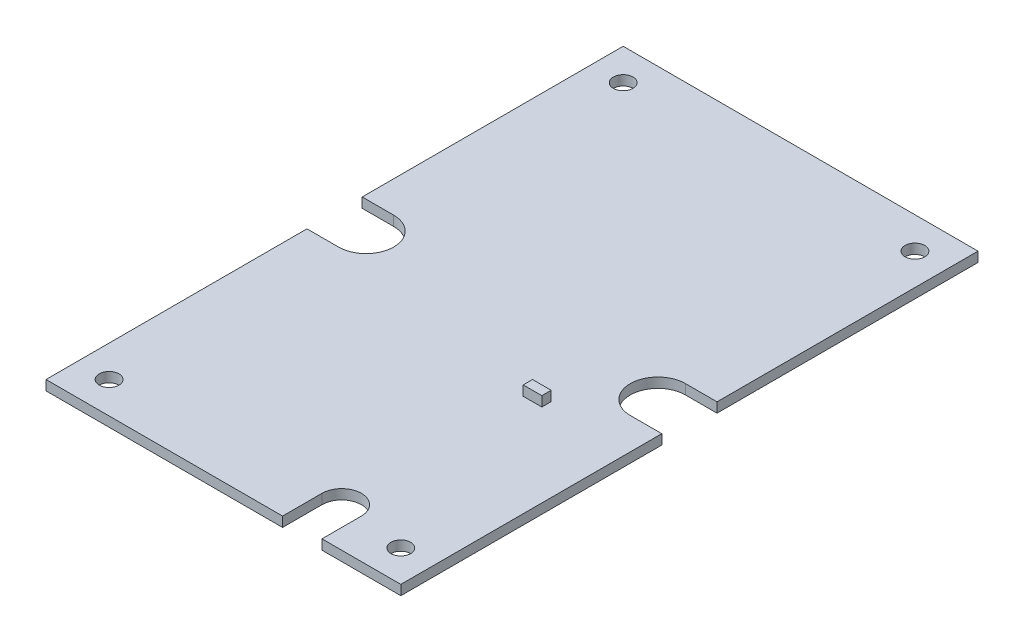
ISO-10303-21;
HEADER;
FILE_DESCRIPTION(('STEP AP214'),'2;1');
FILE_NAME('part.step','',(''),(''),'','','');
FILE_SCHEMA(('AUTOMOTIVE_DESIGN { 1 0 10303 214 1 1 1 1 }'));
ENDSEC;
DATA;
#1=APPLICATION_CONTEXT('core data for automotive mechanical design processes');
#2=APPLICATION_PROTOCOL_DEFINITION('international standard','automotive_design',2000,#1);
#3=PRODUCT_CONTEXT('',#1,'mechanical');
#4=PRODUCT('Part','Part','',(#3));
#5=PRODUCT_RELATED_PRODUCT_CATEGORY('part','',(#4));
#6=PRODUCT_DEFINITION_FORMATION('','',#4);
#7=PRODUCT_DEFINITION_CONTEXT('part definition',#1,'design');
#8=PRODUCT_DEFINITION('design','',#6,#7);
#9=PRODUCT_DEFINITION_SHAPE('','',#8);
#10=(LENGTH_UNIT() NAMED_UNIT(*) SI_UNIT(.MILLI.,.METRE.));
#11=(NAMED_UNIT(*) PLANE_ANGLE_UNIT() SI_UNIT($,.RADIAN.));
#12=(NAMED_UNIT(*) SI_UNIT($,.STERADIAN.) SOLID_ANGLE_UNIT());
#13=UNCERTAINTY_MEASURE_WITH_UNIT(LENGTH_MEASURE(1.E-05),#10,'distance_accuracy_value','');
#14=(GEOMETRIC_REPRESENTATION_CONTEXT(3) GLOBAL_UNCERTAINTY_ASSIGNED_CONTEXT((#13)) GLOBAL_UNIT_ASSIGNED_CONTEXT((#10,
#11,#12)) REPRESENTATION_CONTEXT('',''));
#15=CARTESIAN_POINT('',(0.,0.,0.));
#16=DIRECTION('',(0.,0.,1.));
#17=DIRECTION('',(1.,0.,0.));
#18=AXIS2_PLACEMENT_3D('',#15,#16,#17);
#19=CARTESIAN_POINT('',(0.,1.5875,0.));
#20=DIRECTION('',(0.,-1.,0.));
#21=DIRECTION('',(0.,0.,-1.));
#22=AXIS2_PLACEMENT_3D('',#19,#20,#21);
#23=PLANE('',#22);
#24=DIRECTION('',(0.,0.,-1.));
#25=VECTOR('',#24,1.);
#26=CARTESIAN_POINT('',(38.1,1.5875,0.));
#27=LINE('',#26,#25);
#28=CARTESIAN_POINT('',(38.1,1.5875,0.));
#29=VERTEX_POINT('',#28);
#30=CARTESIAN_POINT('',(38.1,1.5875,-6.35));
#31=VERTEX_POINT('',#30);
#32=EDGE_CURVE('E325',#29,#31,#27,.T.);
#33=ORIENTED_EDGE('',*,*,#32,.T.);
#34=CARTESIAN_POINT('',(41.275,1.5875,-6.35));
#35=DIRECTION('',(0.,1.,0.));
#36=DIRECTION('',(0.,0.,1.));
#37=AXIS2_PLACEMENT_3D('',#34,#35,#36);
#38=CIRCLE('',#37,3.17500000000001);
#39=CARTESIAN_POINT('',(44.45,1.5875,-6.35));
#40=VERTEX_POINT('',#39);
#41=EDGE_CURVE('E331',#40,#31,#38,.T.);
#42=ORIENTED_EDGE('',*,*,#41,.F.);
#43=DIRECTION('',(0.,0.,1.));
#44=VECTOR('',#43,1.);
#45=CARTESIAN_POINT('',(44.45,1.5875,0.));
#46=LINE('',#45,#44);
#47=CARTESIAN_POINT('',(44.45,1.5875,0.));
#48=VERTEX_POINT('',#47);
#49=EDGE_CURVE('E328',#40,#48,#46,.T.);
#50=ORIENTED_EDGE('',*,*,#49,.T.);
#51=DIRECTION('',(1.,0.,0.));
#52=VECTOR('',#51,1.);
#53=CARTESIAN_POINT('',(0.,1.5875,0.));
#54=LINE('',#53,#52);
#55=CARTESIAN_POINT('',(57.15,1.5875,0.));
#56=VERTEX_POINT('',#55);
#57=EDGE_CURVE('E422',#48,#56,#54,.T.);
#58=ORIENTED_EDGE('',*,*,#57,.T.);
#59=DIRECTION('',(0.,0.,-1.));
#60=VECTOR('',#59,1.);
#61=CARTESIAN_POINT('',(57.15,1.5875,0.));
#62=LINE('',#61,#60);
#63=CARTESIAN_POINT('',(57.15,1.5875,-42.037));
#64=VERTEX_POINT('',#63);
#65=EDGE_CURVE('E428',#56,#64,#62,.T.);
#66=ORIENTED_EDGE('',*,*,#65,.T.);
#67=DIRECTION('',(1.,0.,0.));
#68=VECTOR('',#67,1.);
#69=CARTESIAN_POINT('',(0.,1.5875,-42.037));
#70=LINE('',#69,#68);
#71=CARTESIAN_POINT('',(52.07,1.5875,-42.037));
#72=VERTEX_POINT('',#71);
#73=EDGE_CURVE('E348',#72,#64,#70,.T.);
#74=ORIENTED_EDGE('',*,*,#73,.F.);
#75=CARTESIAN_POINT('',(52.07,1.5875,-46.482));
#76=DIRECTION('',(0.,1.,0.));
#77=DIRECTION('',(0.,0.,1.));
#78=AXIS2_PLACEMENT_3D('',#75,#76,#77);
#79=CIRCLE('',#78,4.445);
#80=CARTESIAN_POINT('',(52.07,1.5875,-50.927));
#81=VERTEX_POINT('',#80);
#82=EDGE_CURVE('E358',#81,#72,#79,.T.);
#83=ORIENTED_EDGE('',*,*,#82,.F.);
#84=DIRECTION('',(-1.,0.,0.));
#85=VECTOR('',#84,1.);
#86=CARTESIAN_POINT('',(0.,1.5875,-50.927));
#87=LINE('',#86,#85);
#88=CARTESIAN_POINT('',(57.15,1.5875,-50.927));
#89=VERTEX_POINT('',#88);
#90=EDGE_CURVE('E355',#89,#81,#87,.T.);
#91=ORIENTED_EDGE('',*,*,#90,.F.);
#92=CARTESIAN_POINT('',(57.15,1.5875,-92.964));
#93=VERTEX_POINT('',#92);
#94=EDGE_CURVE('E427',#89,#93,#62,.T.);
#95=ORIENTED_EDGE('',*,*,#94,.T.);
#96=DIRECTION('',(-1.,0.,0.));
#97=VECTOR('',#96,1.);
#98=CARTESIAN_POINT('',(0.,1.5875,-92.964));
#99=LINE('',#98,#97);
#100=CARTESIAN_POINT('',(0.,1.5875,-92.964));
#101=VERTEX_POINT('',#100);
#102=EDGE_CURVE('E431',#93,#101,#99,.T.);
#103=ORIENTED_EDGE('',*,*,#102,.T.);
#104=DIRECTION('',(0.,0.,1.));
#105=VECTOR('',#104,1.);
#106=CARTESIAN_POINT('',(0.,1.5875,0.));
#107=LINE('',#106,#105);
#108=CARTESIAN_POINT('',(0.,1.5875,-50.927));
#109=VERTEX_POINT('',#108);
#110=EDGE_CURVE('E419',#101,#109,#107,.T.);
#111=ORIENTED_EDGE('',*,*,#110,.T.);
#112=DIRECTION('',(1.,0.,0.));
#113=VECTOR('',#112,1.);
#114=CARTESIAN_POINT('',(0.,1.5875,-50.927));
#115=LINE('',#114,#113);
#116=CARTESIAN_POINT('',(5.08,1.5875,-50.927));
#117=VERTEX_POINT('',#116);
#118=EDGE_CURVE('E382',#109,#117,#115,.T.);
#119=ORIENTED_EDGE('',*,*,#118,.T.);
#120=CARTESIAN_POINT('',(5.08,1.5875,-46.482));
#121=DIRECTION('',(0.,1.,0.));
#122=DIRECTION('',(0.,0.,1.));
#123=AXIS2_PLACEMENT_3D('',#120,#121,#122);
#124=CIRCLE('',#123,4.445);
#125=CARTESIAN_POINT('',(5.08,1.5875,-42.037));
#126=VERTEX_POINT('',#125);
#127=EDGE_CURVE('E337',#117,#126,#124,.F.);
#128=ORIENTED_EDGE('',*,*,#127,.T.);
#129=DIRECTION('',(-1.,0.,0.));
#130=VECTOR('',#129,1.);
#131=CARTESIAN_POINT('',(0.,1.5875,-42.037));
#132=LINE('',#131,#130);
#133=CARTESIAN_POINT('',(0.,1.5875,-42.037));
#134=VERTEX_POINT('',#133);
#135=EDGE_CURVE('E375',#126,#134,#132,.T.);
#136=ORIENTED_EDGE('',*,*,#135,.T.);
#137=CARTESIAN_POINT('',(0.,1.5875,0.));
#138=VERTEX_POINT('',#137);
#139=EDGE_CURVE('E423',#134,#138,#107,.T.);
#140=ORIENTED_EDGE('',*,*,#139,.T.);
#141=EDGE_CURVE('E424',#138,#29,#54,.T.);
#142=ORIENTED_EDGE('',*,*,#141,.T.);
#143=EDGE_LOOP('',(#33,#42,#50,#58,#66,#74,#83,#91,#95,#103,#111,#119,#128,#136,#140,#142));
#144=FACE_BOUND('',#143,.T.);
#145=CARTESIAN_POINT('',(5.07999999999997,1.5875,-87.884));
#146=DIRECTION('',(0.,1.,0.));
#147=DIRECTION('',(0.,0.,1.));
#148=AXIS2_PLACEMENT_3D('',#145,#146,#147);
#149=CIRCLE('',#148,1.5875);
#150=CARTESIAN_POINT('',(5.07999999999997,1.5875,-86.2965));
#151=VERTEX_POINT('',#150);
#152=EDGE_CURVE('E404',#151,#151,#149,.T.);
#153=ORIENTED_EDGE('',*,*,#152,.F.);
#154=EDGE_LOOP('',(#153));
#155=FACE_BOUND('',#154,.T.);
#156=CARTESIAN_POINT('',(52.07,1.5875,-5.08000000000002));
#157=DIRECTION('',(0.,1.,0.));
#158=DIRECTION('',(0.,0.,1.));
#159=AXIS2_PLACEMENT_3D('',#156,#157,#158);
#160=CIRCLE('',#159,1.5875);
#161=CARTESIAN_POINT('',(52.07,1.5875,-3.49250000000002));
#162=VERTEX_POINT('',#161);
#163=EDGE_CURVE('E395',#162,#162,#160,.T.);
#164=ORIENTED_EDGE('',*,*,#163,.F.);
#165=EDGE_LOOP('',(#164));
#166=FACE_BOUND('',#165,.T.);
#167=CARTESIAN_POINT('',(5.08,1.5875,-5.08));
#168=DIRECTION('',(0.,1.,0.));
#169=DIRECTION('',(0.,0.,1.));
#170=AXIS2_PLACEMENT_3D('',#167,#168,#169);
#171=CIRCLE('',#170,1.5875);
#172=CARTESIAN_POINT('',(5.08,1.5875,-3.4925));
#173=VERTEX_POINT('',#172);
#174=EDGE_CURVE('E408',#173,#173,#171,.T.);
#175=ORIENTED_EDGE('',*,*,#174,.F.);
#176=EDGE_LOOP('',(#175));
#177=FACE_BOUND('',#176,.T.);
#178=CARTESIAN_POINT('',(52.07,1.5875,-87.884));
#179=DIRECTION('',(0.,1.,0.));
#180=DIRECTION('',(0.,0.,1.));
#181=AXIS2_PLACEMENT_3D('',#178,#179,#180);
#182=CIRCLE('',#181,1.5875);
#183=CARTESIAN_POINT('',(52.07,1.5875,-86.2965));
#184=VERTEX_POINT('',#183);
#185=EDGE_CURVE('E401',#184,#184,#182,.T.);
#186=ORIENTED_EDGE('',*,*,#185,.F.);
#187=EDGE_LOOP('',(#186));
#188=FACE_BOUND('',#187,.T.);
#189=DIRECTION('',(0.,0.,-1.));
#190=VECTOR('',#189,1.);
#191=CARTESIAN_POINT('',(43.7704588014712,1.5875,-36.092));
#192=LINE('',#191,#190);
#193=CARTESIAN_POINT('',(43.7704588014712,1.5875,-36.092));
#194=VERTEX_POINT('',#193);
#195=CARTESIAN_POINT('',(43.7704588014712,1.5875,-37.592));
#196=VERTEX_POINT('',#195);
#197=EDGE_CURVE('E243',#194,#196,#192,.T.);
#198=ORIENTED_EDGE('',*,*,#197,.F.);
#199=DIRECTION('',(1.,0.,0.));
#200=VECTOR('',#199,1.);
#201=CARTESIAN_POINT('',(43.7704588014712,1.5875,-36.092));
#202=LINE('',#201,#200);
#203=CARTESIAN_POINT('',(40.7704588014712,1.5875,-36.092));
#204=VERTEX_POINT('',#203);
#205=EDGE_CURVE('E240',#204,#194,#202,.T.);
#206=ORIENTED_EDGE('',*,*,#205,.F.);
#207=DIRECTION('',(0.,0.,1.));
#208=VECTOR('',#207,1.);
#209=CARTESIAN_POINT('',(40.7704588014712,1.5875,-36.092));
#210=LINE('',#209,#208);
#211=CARTESIAN_POINT('',(40.7704588014712,1.5875,-37.592));
#212=VERTEX_POINT('',#211);
#213=EDGE_CURVE('E58',#212,#204,#210,.T.);
#214=ORIENTED_EDGE('',*,*,#213,.F.);
#215=DIRECTION('',(-1.,0.,0.));
#216=VECTOR('',#215,1.);
#217=CARTESIAN_POINT('',(43.7704588014712,1.5875,-37.592));
#218=LINE('',#217,#216);
#219=EDGE_CURVE('E53',#196,#212,#218,.T.);
#220=ORIENTED_EDGE('',*,*,#219,.F.);
#221=EDGE_LOOP('',(#198,#206,#214,#220));
#222=FACE_BOUND('',#221,.T.);
#223=ADVANCED_FACE('F38',(#144,#155,#166,#177,#188,#222),#23,.F.);
#224=CARTESIAN_POINT('',(0.,0.,0.));
#225=DIRECTION('',(0.,-1.,0.));
#226=DIRECTION('',(0.,0.,-1.));
#227=AXIS2_PLACEMENT_3D('',#224,#225,#226);
#228=PLANE('',#227);
#229=DIRECTION('',(0.,0.,-1.));
#230=VECTOR('',#229,1.);
#231=CARTESIAN_POINT('',(7.16480117844235,0.,0.));
#232=LINE('',#231,#230);
#233=CARTESIAN_POINT('',(7.16480117844235,0.,-78.6770599886841));
#234=VERTEX_POINT('',#233);
#235=CARTESIAN_POINT('',(7.16480117844235,0.,-81.6770599886841));
#236=VERTEX_POINT('',#235);
#237=EDGE_CURVE('E244',#234,#236,#232,.T.);
#238=ORIENTED_EDGE('',*,*,#237,.T.);
#239=DIRECTION('',(1.,0.,0.));
#240=VECTOR('',#239,1.);
#241=CARTESIAN_POINT('',(0.,0.,-81.6770599886841));
#242=LINE('',#241,#240);
#243=CARTESIAN_POINT('',(3.16480117844235,0.,-81.6770599886841));
#244=VERTEX_POINT('',#243);
#245=EDGE_CURVE('E257',#244,#236,#242,.T.);
#246=ORIENTED_EDGE('',*,*,#245,.F.);
#247=DIRECTION('',(0.,0.,-1.));
#248=VECTOR('',#247,1.);
#249=CARTESIAN_POINT('',(3.16480117844235,0.,0.));
#250=LINE('',#249,#248);
#251=CARTESIAN_POINT('',(3.16480117844235,0.,-78.6770599886841));
#252=VERTEX_POINT('',#251);
#253=EDGE_CURVE('E267',#252,#244,#250,.T.);
#254=ORIENTED_EDGE('',*,*,#253,.F.);
#255=DIRECTION('',(1.,0.,0.));
#256=VECTOR('',#255,1.);
#257=CARTESIAN_POINT('',(-2.72965885966412E-13,0.,-78.6770599886841));
#258=LINE('',#257,#256);
#259=EDGE_CURVE('E247',#252,#234,#258,.T.);
#260=ORIENTED_EDGE('',*,*,#259,.T.);
#261=EDGE_LOOP('',(#238,#246,#254,#260));
#262=FACE_BOUND('',#261,.T.);
#263=CARTESIAN_POINT('',(5.07999999999999,0.,-70.739));
#264=DIRECTION('',(0.,-1.,0.));
#265=DIRECTION('',(0.,0.,-1.));
#266=AXIS2_PLACEMENT_3D('',#263,#264,#265);
#267=CIRCLE('',#266,4.7244);
#268=CARTESIAN_POINT('',(5.07999999999999,0.,-75.4634));
#269=VERTEX_POINT('',#268);
#270=EDGE_CURVE('E312',#269,#269,#267,.T.);
#271=ORIENTED_EDGE('',*,*,#270,.F.);
#272=EDGE_LOOP('',(#271));
#273=FACE_BOUND('',#272,.T.);
#274=CARTESIAN_POINT('',(52.07,0.,-87.884));
#275=DIRECTION('',(0.,1.,0.));
#276=DIRECTION('',(0.,0.,1.));
#277=AXIS2_PLACEMENT_3D('',#274,#275,#276);
#278=CIRCLE('',#277,1.5875);
#279=CARTESIAN_POINT('',(52.07,0.,-86.2965));
#280=VERTEX_POINT('',#279);
#281=EDGE_CURVE('E405',#280,#280,#278,.T.);
#282=ORIENTED_EDGE('',*,*,#281,.T.);
#283=EDGE_LOOP('',(#282));
#284=FACE_BOUND('',#283,.T.);
#285=CARTESIAN_POINT('',(5.08,0.,-5.08));
#286=DIRECTION('',(0.,1.,0.));
#287=DIRECTION('',(0.,0.,1.));
#288=AXIS2_PLACEMENT_3D('',#285,#286,#287);
#289=CIRCLE('',#288,1.5875);
#290=CARTESIAN_POINT('',(5.08,0.,-3.4925));
#291=VERTEX_POINT('',#290);
#292=EDGE_CURVE('E398',#291,#291,#289,.T.);
#293=ORIENTED_EDGE('',*,*,#292,.T.);
#294=EDGE_LOOP('',(#293));
#295=FACE_BOUND('',#294,.T.);
#296=CARTESIAN_POINT('',(52.07,0.,-5.08000000000002));
#297=DIRECTION('',(0.,1.,0.));
#298=DIRECTION('',(0.,0.,1.));
#299=AXIS2_PLACEMENT_3D('',#296,#297,#298);
#300=CIRCLE('',#299,1.5875);
#301=CARTESIAN_POINT('',(52.07,0.,-3.49250000000002));
#302=VERTEX_POINT('',#301);
#303=EDGE_CURVE('E365',#302,#302,#300,.T.);
#304=ORIENTED_EDGE('',*,*,#303,.T.);
#305=EDGE_LOOP('',(#304));
#306=FACE_BOUND('',#305,.T.);
#307=CARTESIAN_POINT('',(5.07999999999997,0.,-87.884));
#308=DIRECTION('',(0.,1.,0.));
#309=DIRECTION('',(0.,0.,1.));
#310=AXIS2_PLACEMENT_3D('',#307,#308,#309);
#311=CIRCLE('',#310,1.5875);
#312=CARTESIAN_POINT('',(5.07999999999997,0.,-86.2965));
#313=VERTEX_POINT('',#312);
#314=EDGE_CURVE('E413',#313,#313,#311,.T.);
#315=ORIENTED_EDGE('',*,*,#314,.T.);
#316=EDGE_LOOP('',(#315));
#317=FACE_BOUND('',#316,.T.);
#318=CARTESIAN_POINT('',(41.275,0.,-6.35));
#319=DIRECTION('',(0.,-1.,0.));
#320=DIRECTION('',(0.,0.,-1.));
#321=AXIS2_PLACEMENT_3D('',#318,#319,#320);
#322=CIRCLE('',#321,3.17500000000001);
#323=CARTESIAN_POINT('',(44.45,0.,-6.35));
#324=VERTEX_POINT('',#323);
#325=CARTESIAN_POINT('',(38.1,0.,-6.35));
#326=VERTEX_POINT('',#325);
#327=EDGE_CURVE('E320',#324,#326,#322,.F.);
#328=ORIENTED_EDGE('',*,*,#327,.T.);
#329=DIRECTION('',(0.,0.,-1.));
#330=VECTOR('',#329,1.);
#331=CARTESIAN_POINT('',(38.1,0.,0.));
#332=LINE('',#331,#330);
#333=CARTESIAN_POINT('',(38.1,0.,0.));
#334=VERTEX_POINT('',#333);
#335=EDGE_CURVE('E323',#334,#326,#332,.T.);
#336=ORIENTED_EDGE('',*,*,#335,.F.);
#337=DIRECTION('',(1.,0.,0.));
#338=VECTOR('',#337,1.);
#339=CARTESIAN_POINT('',(0.,0.,0.));
#340=LINE('',#339,#338);
#341=CARTESIAN_POINT('',(0.,0.,0.));
#342=VERTEX_POINT('',#341);
#343=EDGE_CURVE('E438',#342,#334,#340,.T.);
#344=ORIENTED_EDGE('',*,*,#343,.F.);
#345=DIRECTION('',(0.,0.,1.));
#346=VECTOR('',#345,1.);
#347=CARTESIAN_POINT('',(0.,0.,0.));
#348=LINE('',#347,#346);
#349=CARTESIAN_POINT('',(0.,0.,-42.037));
#350=VERTEX_POINT('',#349);
#351=EDGE_CURVE('E416',#350,#342,#348,.T.);
#352=ORIENTED_EDGE('',*,*,#351,.F.);
#353=DIRECTION('',(-1.,0.,0.));
#354=VECTOR('',#353,1.);
#355=CARTESIAN_POINT('',(0.,0.,-42.037));
#356=LINE('',#355,#354);
#357=CARTESIAN_POINT('',(5.08,0.,-42.037));
#358=VERTEX_POINT('',#357);
#359=EDGE_CURVE('E377',#358,#350,#356,.T.);
#360=ORIENTED_EDGE('',*,*,#359,.F.);
#361=CARTESIAN_POINT('',(5.08,0.,-46.482));
#362=DIRECTION('',(0.,1.,0.));
#363=DIRECTION('',(0.,0.,1.));
#364=AXIS2_PLACEMENT_3D('',#361,#362,#363);
#365=CIRCLE('',#364,4.445);
#366=CARTESIAN_POINT('',(5.08,0.,-50.927));
#367=VERTEX_POINT('',#366);
#368=EDGE_CURVE('E372',#367,#358,#365,.F.);
#369=ORIENTED_EDGE('',*,*,#368,.F.);
#370=DIRECTION('',(1.,0.,0.));
#371=VECTOR('',#370,1.);
#372=CARTESIAN_POINT('',(0.,0.,-50.927));
#373=LINE('',#372,#371);
#374=CARTESIAN_POINT('',(0.,0.,-50.927));
#375=VERTEX_POINT('',#374);
#376=EDGE_CURVE('E374',#375,#367,#373,.T.);
#377=ORIENTED_EDGE('',*,*,#376,.F.);
#378=CARTESIAN_POINT('',(0.,0.,-92.964));
#379=VERTEX_POINT('',#378);
#380=EDGE_CURVE('E434',#379,#375,#348,.T.);
#381=ORIENTED_EDGE('',*,*,#380,.F.);
#382=DIRECTION('',(-1.,0.,0.));
#383=VECTOR('',#382,1.);
#384=CARTESIAN_POINT('',(0.,0.,-92.964));
#385=LINE('',#384,#383);
#386=CARTESIAN_POINT('',(57.15,0.,-92.964));
#387=VERTEX_POINT('',#386);
#388=EDGE_CURVE('E445',#387,#379,#385,.T.);
#389=ORIENTED_EDGE('',*,*,#388,.F.);
#390=DIRECTION('',(0.,0.,-1.));
#391=VECTOR('',#390,1.);
#392=CARTESIAN_POINT('',(57.15,0.,0.));
#393=LINE('',#392,#391);
#394=CARTESIAN_POINT('',(57.15,0.,-50.927));
#395=VERTEX_POINT('',#394);
#396=EDGE_CURVE('E441',#395,#387,#393,.T.);
#397=ORIENTED_EDGE('',*,*,#396,.F.);
#398=DIRECTION('',(-1.,0.,0.));
#399=VECTOR('',#398,1.);
#400=CARTESIAN_POINT('',(0.,0.,-50.927));
#401=LINE('',#400,#399);
#402=CARTESIAN_POINT('',(52.07,0.,-50.927));
#403=VERTEX_POINT('',#402);
#404=EDGE_CURVE('E344',#395,#403,#401,.T.);
#405=ORIENTED_EDGE('',*,*,#404,.T.);
#406=CARTESIAN_POINT('',(52.07,0.,-46.482));
#407=DIRECTION('',(0.,1.,0.));
#408=DIRECTION('',(0.,0.,1.));
#409=AXIS2_PLACEMENT_3D('',#406,#407,#408);
#410=CIRCLE('',#409,4.445);
#411=CARTESIAN_POINT('',(52.07,0.,-42.037));
#412=VERTEX_POINT('',#411);
#413=EDGE_CURVE('E347',#403,#412,#410,.T.);
#414=ORIENTED_EDGE('',*,*,#413,.T.);
#415=DIRECTION('',(1.,0.,0.));
#416=VECTOR('',#415,1.);
#417=CARTESIAN_POINT('',(0.,0.,-42.037));
#418=LINE('',#417,#416);
#419=CARTESIAN_POINT('',(57.15,0.,-42.037));
#420=VERTEX_POINT('',#419);
#421=EDGE_CURVE('E351',#412,#420,#418,.T.);
#422=ORIENTED_EDGE('',*,*,#421,.T.);
#423=CARTESIAN_POINT('',(57.15,0.,0.));
#424=VERTEX_POINT('',#423);
#425=EDGE_CURVE('E442',#424,#420,#393,.T.);
#426=ORIENTED_EDGE('',*,*,#425,.F.);
#427=CARTESIAN_POINT('',(44.45,0.,0.));
#428=VERTEX_POINT('',#427);
#429=EDGE_CURVE('E437',#428,#424,#340,.T.);
#430=ORIENTED_EDGE('',*,*,#429,.F.);
#431=DIRECTION('',(0.,0.,1.));
#432=VECTOR('',#431,1.);
#433=CARTESIAN_POINT('',(44.45,0.,0.));
#434=LINE('',#433,#432);
#435=EDGE_CURVE('E316',#324,#428,#434,.T.);
#436=ORIENTED_EDGE('',*,*,#435,.F.);
#437=EDGE_LOOP('',(#328,#336,#344,#352,#360,#369,#377,#381,#389,#397,#405,#414,#422,#426,#430,#436));
#438=FACE_BOUND('',#437,.T.);
#439=DIRECTION('',(0.,0.,1.));
#440=VECTOR('',#439,1.);
#441=CARTESIAN_POINT('',(7.06471022277097,0.,0.));
#442=LINE('',#441,#440);
#443=CARTESIAN_POINT('',(7.06471022277097,0.,-59.987286882683));
#444=VERTEX_POINT('',#443);
#445=CARTESIAN_POINT('',(7.06471022277097,0.,-55.987286882683));
#446=VERTEX_POINT('',#445);
#447=EDGE_CURVE('E295',#444,#446,#442,.T.);
#448=ORIENTED_EDGE('',*,*,#447,.F.);
#449=DIRECTION('',(1.,0.,0.));
#450=VECTOR('',#449,1.);
#451=CARTESIAN_POINT('',(0.,0.,-59.987286882683));
#452=LINE('',#451,#450);
#453=CARTESIAN_POINT('',(3.06471022277097,0.,-59.987286882683));
#454=VERTEX_POINT('',#453);
#455=EDGE_CURVE('E279',#454,#444,#452,.T.);
#456=ORIENTED_EDGE('',*,*,#455,.F.);
#457=DIRECTION('',(0.,0.,1.));
#458=VECTOR('',#457,1.);
#459=CARTESIAN_POINT('',(3.06471022277097,0.,0.));
#460=LINE('',#459,#458);
#461=CARTESIAN_POINT('',(3.06471022277097,0.,-55.987286882683));
#462=VERTEX_POINT('',#461);
#463=EDGE_CURVE('E284',#454,#462,#460,.T.);
#464=ORIENTED_EDGE('',*,*,#463,.T.);
#465=DIRECTION('',(1.,0.,0.));
#466=VECTOR('',#465,1.);
#467=CARTESIAN_POINT('',(0.,0.,-55.987286882683));
#468=LINE('',#467,#466);
#469=EDGE_CURVE('E298',#462,#446,#468,.T.);
#470=ORIENTED_EDGE('',*,*,#469,.T.);
#471=EDGE_LOOP('',(#448,#456,#464,#470));
#472=FACE_BOUND('',#471,.T.);
#473=ADVANCED_FACE('F461',(#262,#273,#284,#295,#306,#317,#438,#472),#228,.T.);
#474=CARTESIAN_POINT('',(0.,1.5875,0.));
#475=DIRECTION('',(0.,0.,-1.));
#476=DIRECTION('',(-1.,0.,0.));
#477=AXIS2_PLACEMENT_3D('',#474,#475,#476);
#478=PLANE('',#477);
#479=DIRECTION('',(0.,1.,0.));
#480=VECTOR('',#479,1.);
#481=CARTESIAN_POINT('',(38.1,-0.000999999999999916,0.));
#482=LINE('',#481,#480);
#483=EDGE_CURVE('E334',#334,#29,#482,.T.);
#484=ORIENTED_EDGE('',*,*,#483,.T.);
#485=ORIENTED_EDGE('',*,*,#141,.F.);
#486=DIRECTION('',(0.,-1.,0.));
#487=VECTOR('',#486,1.);
#488=CARTESIAN_POINT('',(0.,1.5875,0.));
#489=LINE('',#488,#487);
#490=EDGE_CURVE('E11',#138,#342,#489,.T.);
#491=ORIENTED_EDGE('',*,*,#490,.T.);
#492=ORIENTED_EDGE('',*,*,#343,.T.);
#493=EDGE_LOOP('',(#484,#485,#491,#492));
#494=FACE_BOUND('',#493,.T.);
#495=ADVANCED_FACE('F491',(#494),#478,.F.);
#496=DIRECTION('',(0.,1.,0.));
#497=VECTOR('',#496,1.);
#498=CARTESIAN_POINT('',(44.45,-0.000999999999999916,0.));
#499=LINE('',#498,#497);
#500=EDGE_CURVE('E340',#428,#48,#499,.T.);
#501=ORIENTED_EDGE('',*,*,#500,.F.);
#502=ORIENTED_EDGE('',*,*,#429,.T.);
#503=DIRECTION('',(0.,-1.,0.));
#504=VECTOR('',#503,1.);
#505=CARTESIAN_POINT('',(57.15,1.5875,0.));
#506=LINE('',#505,#504);
#507=EDGE_CURVE('E46',#56,#424,#506,.T.);
#508=ORIENTED_EDGE('',*,*,#507,.F.);
#509=ORIENTED_EDGE('',*,*,#57,.F.);
#510=EDGE_LOOP('',(#501,#502,#508,#509));
#511=FACE_BOUND('',#510,.T.);
#512=ADVANCED_FACE('F478',(#511),#478,.F.);
#513=CARTESIAN_POINT('',(0.,1.5875,0.));
#514=DIRECTION('',(1.,0.,0.));
#515=DIRECTION('',(0.,0.,-1.));
#516=AXIS2_PLACEMENT_3D('',#513,#514,#515);
#517=PLANE('',#516);
#518=DIRECTION('',(0.,1.,0.));
#519=VECTOR('',#518,1.);
#520=CARTESIAN_POINT('',(0.,0.,-42.037));
#521=LINE('',#520,#519);
#522=EDGE_CURVE('E389',#350,#134,#521,.T.);
#523=ORIENTED_EDGE('',*,*,#522,.F.);
#524=ORIENTED_EDGE('',*,*,#351,.T.);
#525=ORIENTED_EDGE('',*,*,#490,.F.);
#526=ORIENTED_EDGE('',*,*,#139,.F.);
#527=EDGE_LOOP('',(#523,#524,#525,#526));
#528=FACE_BOUND('',#527,.T.);
#529=ADVANCED_FACE('F40',(#528),#517,.F.);
#530=DIRECTION('',(0.,1.,0.));
#531=VECTOR('',#530,1.);
#532=CARTESIAN_POINT('',(0.,0.,-50.927));
#533=LINE('',#532,#531);
#534=EDGE_CURVE('E391',#375,#109,#533,.T.);
#535=ORIENTED_EDGE('',*,*,#534,.T.);
#536=ORIENTED_EDGE('',*,*,#110,.F.);
#537=DIRECTION('',(0.,-1.,0.));
#538=VECTOR('',#537,1.);
#539=CARTESIAN_POINT('',(0.,1.5875,-92.964));
#540=LINE('',#539,#538);
#541=EDGE_CURVE('E433',#101,#379,#540,.T.);
#542=ORIENTED_EDGE('',*,*,#541,.T.);
#543=ORIENTED_EDGE('',*,*,#380,.T.);
#544=EDGE_LOOP('',(#535,#536,#542,#543));
#545=FACE_BOUND('',#544,.T.);
#546=ADVANCED_FACE('F511',(#545),#517,.F.);
#547=CARTESIAN_POINT('',(57.15,1.5875,0.));
#548=DIRECTION('',(-1.,0.,0.));
#549=DIRECTION('',(0.,0.,1.));
#550=AXIS2_PLACEMENT_3D('',#547,#548,#549);
#551=PLANE('',#550);
#552=ORIENTED_EDGE('',*,*,#94,.F.);
#553=DIRECTION('',(0.,1.,0.));
#554=VECTOR('',#553,1.);
#555=CARTESIAN_POINT('',(57.15,0.,-50.927));
#556=LINE('',#555,#554);
#557=EDGE_CURVE('E363',#395,#89,#556,.T.);
#558=ORIENTED_EDGE('',*,*,#557,.F.);
#559=ORIENTED_EDGE('',*,*,#396,.T.);
#560=DIRECTION('',(0.,-1.,0.));
#561=VECTOR('',#560,1.);
#562=CARTESIAN_POINT('',(57.15,1.5875,-92.964));
#563=LINE('',#562,#561);
#564=EDGE_CURVE('E449',#93,#387,#563,.T.);
#565=ORIENTED_EDGE('',*,*,#564,.F.);
#566=EDGE_LOOP('',(#552,#558,#559,#565));
#567=FACE_BOUND('',#566,.T.);
#568=ADVANCED_FACE('F522',(#567),#551,.F.);
#569=ORIENTED_EDGE('',*,*,#425,.T.);
#570=DIRECTION('',(0.,1.,0.));
#571=VECTOR('',#570,1.);
#572=CARTESIAN_POINT('',(57.15,0.,-42.037));
#573=LINE('',#572,#571);
#574=EDGE_CURVE('E366',#420,#64,#573,.T.);
#575=ORIENTED_EDGE('',*,*,#574,.T.);
#576=ORIENTED_EDGE('',*,*,#65,.F.);
#577=ORIENTED_EDGE('',*,*,#507,.T.);
#578=EDGE_LOOP('',(#569,#575,#576,#577));
#579=FACE_BOUND('',#578,.T.);
#580=ADVANCED_FACE('F456',(#579),#551,.F.);
#581=CARTESIAN_POINT('',(0.,1.5875,-92.964));
#582=DIRECTION('',(0.,0.,1.));
#583=DIRECTION('',(1.,0.,0.));
#584=AXIS2_PLACEMENT_3D('',#581,#582,#583);
#585=PLANE('',#584);
#586=ORIENTED_EDGE('',*,*,#388,.T.);
#587=ORIENTED_EDGE('',*,*,#541,.F.);
#588=ORIENTED_EDGE('',*,*,#102,.F.);
#589=ORIENTED_EDGE('',*,*,#564,.T.);
#590=EDGE_LOOP('',(#586,#587,#588,#589));
#591=FACE_BOUND('',#590,.T.);
#592=ADVANCED_FACE('F517',(#591),#585,.F.);
#593=CARTESIAN_POINT('',(5.07999999999997,0.,-87.884));
#594=DIRECTION('',(0.,1.,0.));
#595=DIRECTION('',(0.,0.,1.));
#596=AXIS2_PLACEMENT_3D('',#593,#594,#595);
#597=CYLINDRICAL_SURFACE('',#596,1.5875);
#598=ORIENTED_EDGE('',*,*,#314,.F.);
#599=EDGE_LOOP('',(#598));
#600=FACE_BOUND('',#599,.T.);
#601=ORIENTED_EDGE('',*,*,#152,.T.);
#602=EDGE_LOOP('',(#601));
#603=FACE_BOUND('',#602,.T.);
#604=ADVANCED_FACE('F544',(#600,#603),#597,.F.);
#605=CARTESIAN_POINT('',(52.07,0.,-5.08000000000002));
#606=DIRECTION('',(0.,1.,0.));
#607=DIRECTION('',(0.,0.,1.));
#608=AXIS2_PLACEMENT_3D('',#605,#606,#607);
#609=CYLINDRICAL_SURFACE('',#608,1.5875);
#610=ORIENTED_EDGE('',*,*,#303,.F.);
#611=EDGE_LOOP('',(#610));
#612=FACE_BOUND('',#611,.T.);
#613=ORIENTED_EDGE('',*,*,#163,.T.);
#614=EDGE_LOOP('',(#613));
#615=FACE_BOUND('',#614,.T.);
#616=ADVANCED_FACE('F580',(#612,#615),#609,.F.);
#617=CARTESIAN_POINT('',(5.08,0.,-5.08));
#618=DIRECTION('',(0.,1.,0.));
#619=DIRECTION('',(0.,0.,1.));
#620=AXIS2_PLACEMENT_3D('',#617,#618,#619);
#621=CYLINDRICAL_SURFACE('',#620,1.5875);
#622=ORIENTED_EDGE('',*,*,#292,.F.);
#623=EDGE_LOOP('',(#622));
#624=FACE_BOUND('',#623,.T.);
#625=ORIENTED_EDGE('',*,*,#174,.T.);
#626=EDGE_LOOP('',(#625));
#627=FACE_BOUND('',#626,.T.);
#628=ADVANCED_FACE('F587',(#624,#627),#621,.F.);
#629=CARTESIAN_POINT('',(52.07,0.,-87.884));
#630=DIRECTION('',(0.,1.,0.));
#631=DIRECTION('',(0.,0.,1.));
#632=AXIS2_PLACEMENT_3D('',#629,#630,#631);
#633=CYLINDRICAL_SURFACE('',#632,1.5875);
#634=ORIENTED_EDGE('',*,*,#281,.F.);
#635=EDGE_LOOP('',(#634));
#636=FACE_BOUND('',#635,.T.);
#637=ORIENTED_EDGE('',*,*,#185,.T.);
#638=EDGE_LOOP('',(#637));
#639=FACE_BOUND('',#638,.T.);
#640=ADVANCED_FACE('F595',(#636,#639),#633,.F.);
#641=CARTESIAN_POINT('',(5.08,0.,-46.482));
#642=DIRECTION('',(0.,1.,0.));
#643=DIRECTION('',(0.,0.,1.));
#644=AXIS2_PLACEMENT_3D('',#641,#642,#643);
#645=CYLINDRICAL_SURFACE('',#644,4.445);
#646=ORIENTED_EDGE('',*,*,#127,.F.);
#647=DIRECTION('',(0.,1.,0.));
#648=VECTOR('',#647,1.);
#649=CARTESIAN_POINT('',(5.08,0.,-50.927));
#650=LINE('',#649,#648);
#651=EDGE_CURVE('E379',#367,#117,#650,.T.);
#652=ORIENTED_EDGE('',*,*,#651,.F.);
#653=ORIENTED_EDGE('',*,*,#368,.T.);
#654=DIRECTION('',(0.,1.,0.));
#655=VECTOR('',#654,1.);
#656=CARTESIAN_POINT('',(5.08,0.,-42.037));
#657=LINE('',#656,#655);
#658=EDGE_CURVE('E359',#358,#126,#657,.T.);
#659=ORIENTED_EDGE('',*,*,#658,.T.);
#660=EDGE_LOOP('',(#646,#652,#653,#659));
#661=FACE_BOUND('',#660,.T.);
#662=ADVANCED_FACE('F505',(#661),#645,.F.);
#663=CARTESIAN_POINT('',(0.,0.,-42.037));
#664=DIRECTION('',(0.,0.,-1.));
#665=DIRECTION('',(-1.,0.,0.));
#666=AXIS2_PLACEMENT_3D('',#663,#664,#665);
#667=PLANE('',#666);
#668=ORIENTED_EDGE('',*,*,#135,.F.);
#669=ORIENTED_EDGE('',*,*,#658,.F.);
#670=ORIENTED_EDGE('',*,*,#359,.T.);
#671=ORIENTED_EDGE('',*,*,#522,.T.);
#672=EDGE_LOOP('',(#668,#669,#670,#671));
#673=FACE_BOUND('',#672,.T.);
#674=ADVANCED_FACE('F502',(#673),#667,.T.);
#675=CARTESIAN_POINT('',(0.,0.,-50.927));
#676=DIRECTION('',(0.,0.,1.));
#677=DIRECTION('',(1.,0.,0.));
#678=AXIS2_PLACEMENT_3D('',#675,#676,#677);
#679=PLANE('',#678);
#680=ORIENTED_EDGE('',*,*,#118,.F.);
#681=ORIENTED_EDGE('',*,*,#534,.F.);
#682=ORIENTED_EDGE('',*,*,#376,.T.);
#683=ORIENTED_EDGE('',*,*,#651,.T.);
#684=EDGE_LOOP('',(#680,#681,#682,#683));
#685=FACE_BOUND('',#684,.T.);
#686=ADVANCED_FACE('F509',(#685),#679,.T.);
#687=CARTESIAN_POINT('',(0.,0.,-50.927));
#688=DIRECTION('',(0.,0.,-1.));
#689=DIRECTION('',(-1.,0.,0.));
#690=AXIS2_PLACEMENT_3D('',#687,#688,#689);
#691=PLANE('',#690);
#692=ORIENTED_EDGE('',*,*,#90,.T.);
#693=DIRECTION('',(0.,1.,0.));
#694=VECTOR('',#693,1.);
#695=CARTESIAN_POINT('',(52.07,0.,-50.927));
#696=LINE('',#695,#694);
#697=EDGE_CURVE('E354',#403,#81,#696,.T.);
#698=ORIENTED_EDGE('',*,*,#697,.F.);
#699=ORIENTED_EDGE('',*,*,#404,.F.);
#700=ORIENTED_EDGE('',*,*,#557,.T.);
#701=EDGE_LOOP('',(#692,#698,#699,#700));
#702=FACE_BOUND('',#701,.T.);
#703=ADVANCED_FACE('F525',(#702),#691,.F.);
#704=CARTESIAN_POINT('',(0.,0.,-42.037));
#705=DIRECTION('',(0.,0.,1.));
#706=DIRECTION('',(1.,0.,0.));
#707=AXIS2_PLACEMENT_3D('',#704,#705,#706);
#708=PLANE('',#707);
#709=ORIENTED_EDGE('',*,*,#73,.T.);
#710=ORIENTED_EDGE('',*,*,#574,.F.);
#711=ORIENTED_EDGE('',*,*,#421,.F.);
#712=DIRECTION('',(0.,1.,0.));
#713=VECTOR('',#712,1.);
#714=CARTESIAN_POINT('',(52.07,0.,-42.037));
#715=LINE('',#714,#713);
#716=EDGE_CURVE('E369',#412,#72,#715,.T.);
#717=ORIENTED_EDGE('',*,*,#716,.T.);
#718=EDGE_LOOP('',(#709,#710,#711,#717));
#719=FACE_BOUND('',#718,.T.);
#720=ADVANCED_FACE('F467',(#719),#708,.F.);
#721=CARTESIAN_POINT('',(52.07,0.,-46.482));
#722=DIRECTION('',(0.,1.,0.));
#723=DIRECTION('',(0.,0.,1.));
#724=AXIS2_PLACEMENT_3D('',#721,#722,#723);
#725=CYLINDRICAL_SURFACE('',#724,4.445);
#726=ORIENTED_EDGE('',*,*,#82,.T.);
#727=ORIENTED_EDGE('',*,*,#716,.F.);
#728=ORIENTED_EDGE('',*,*,#413,.F.);
#729=ORIENTED_EDGE('',*,*,#697,.T.);
#730=EDGE_LOOP('',(#726,#727,#728,#729));
#731=FACE_BOUND('',#730,.T.);
#732=ADVANCED_FACE('F469',(#731),#725,.F.);
#733=CARTESIAN_POINT('',(38.1,-0.000999999999999916,0.));
#734=DIRECTION('',(1.,0.,0.));
#735=DIRECTION('',(0.,0.,-1.));
#736=AXIS2_PLACEMENT_3D('',#733,#734,#735);
#737=PLANE('',#736);
#738=ORIENTED_EDGE('',*,*,#335,.T.);
#739=DIRECTION('',(0.,1.,0.));
#740=VECTOR('',#739,1.);
#741=CARTESIAN_POINT('',(38.1,-0.000999999999999916,-6.35));
#742=LINE('',#741,#740);
#743=EDGE_CURVE('E335',#326,#31,#742,.T.);
#744=ORIENTED_EDGE('',*,*,#743,.T.);
#745=ORIENTED_EDGE('',*,*,#32,.F.);
#746=ORIENTED_EDGE('',*,*,#483,.F.);
#747=EDGE_LOOP('',(#738,#744,#745,#746));
#748=FACE_BOUND('',#747,.T.);
#749=ADVANCED_FACE('F488',(#748),#737,.T.);
#750=CARTESIAN_POINT('',(41.275,-0.000999999999999916,-6.35));
#751=DIRECTION('',(0.,1.,0.));
#752=DIRECTION('',(0.,0.,1.));
#753=AXIS2_PLACEMENT_3D('',#750,#751,#752);
#754=CYLINDRICAL_SURFACE('',#753,3.17500000000001);
#755=DIRECTION('',(0.,1.,0.));
#756=VECTOR('',#755,1.);
#757=CARTESIAN_POINT('',(44.45,-0.000999999999999916,-6.35));
#758=LINE('',#757,#756);
#759=EDGE_CURVE('E338',#324,#40,#758,.T.);
#760=ORIENTED_EDGE('',*,*,#759,.T.);
#761=ORIENTED_EDGE('',*,*,#41,.T.);
#762=ORIENTED_EDGE('',*,*,#743,.F.);
#763=ORIENTED_EDGE('',*,*,#327,.F.);
#764=EDGE_LOOP('',(#760,#761,#762,#763));
#765=FACE_BOUND('',#764,.T.);
#766=ADVANCED_FACE('F486',(#765),#754,.F.);
#767=CARTESIAN_POINT('',(44.45,-0.000999999999999916,0.));
#768=DIRECTION('',(-1.,0.,0.));
#769=DIRECTION('',(0.,0.,1.));
#770=AXIS2_PLACEMENT_3D('',#767,#768,#769);
#771=PLANE('',#770);
#772=ORIENTED_EDGE('',*,*,#435,.T.);
#773=ORIENTED_EDGE('',*,*,#500,.T.);
#774=ORIENTED_EDGE('',*,*,#49,.F.);
#775=ORIENTED_EDGE('',*,*,#759,.F.);
#776=EDGE_LOOP('',(#772,#773,#774,#775));
#777=FACE_BOUND('',#776,.T.);
#778=ADVANCED_FACE('F480',(#777),#771,.T.);
#779=CARTESIAN_POINT('',(5.07999999999999,-6.35,-70.739));
#780=DIRECTION('',(0.,1.,0.));
#781=DIRECTION('',(0.,0.,1.));
#782=AXIS2_PLACEMENT_3D('',#779,#780,#781);
#783=CYLINDRICAL_SURFACE('',#782,4.7244);
#784=CARTESIAN_POINT('',(5.07999999999999,-6.35,-70.739));
#785=DIRECTION('',(0.,-1.,0.));
#786=DIRECTION('',(0.,0.,-1.));
#787=AXIS2_PLACEMENT_3D('',#784,#785,#786);
#788=CIRCLE('',#787,4.7244);
#789=CARTESIAN_POINT('',(5.07999999999999,-6.35,-75.4634));
#790=VERTEX_POINT('',#789);
#791=EDGE_CURVE('E313',#790,#790,#788,.T.);
#792=ORIENTED_EDGE('',*,*,#791,.F.);
#793=EDGE_LOOP('',(#792));
#794=FACE_BOUND('',#793,.T.);
#795=ORIENTED_EDGE('',*,*,#270,.T.);
#796=EDGE_LOOP('',(#795));
#797=FACE_BOUND('',#796,.T.);
#798=ADVANCED_FACE('F667',(#794,#797),#783,.T.);
#799=CARTESIAN_POINT('',(0.,-6.35,0.));
#800=DIRECTION('',(0.,-1.,0.));
#801=DIRECTION('',(0.,0.,-1.));
#802=AXIS2_PLACEMENT_3D('',#799,#800,#801);
#803=PLANE('',#802);
#804=ORIENTED_EDGE('',*,*,#791,.T.);
#805=EDGE_LOOP('',(#804));
#806=FACE_BOUND('',#805,.T.);
#807=ADVANCED_FACE('F677',(#806),#803,.T.);
#808=CARTESIAN_POINT('',(0.,-1.5875,-59.987286882683));
#809=DIRECTION('',(0.,0.,1.));
#810=DIRECTION('',(1.,0.,0.));
#811=AXIS2_PLACEMENT_3D('',#808,#809,#810);
#812=PLANE('',#811);
#813=ORIENTED_EDGE('',*,*,#455,.T.);
#814=DIRECTION('',(0.,1.,0.));
#815=VECTOR('',#814,1.);
#816=CARTESIAN_POINT('',(7.06471022277097,-1.5875,-59.987286882683));
#817=LINE('',#816,#815);
#818=CARTESIAN_POINT('',(7.06471022277097,-1.5875,-59.987286882683));
#819=VERTEX_POINT('',#818);
#820=EDGE_CURVE('E309',#819,#444,#817,.T.);
#821=ORIENTED_EDGE('',*,*,#820,.F.);
#822=DIRECTION('',(1.,0.,0.));
#823=VECTOR('',#822,1.);
#824=CARTESIAN_POINT('',(0.,-1.5875,-59.987286882683));
#825=LINE('',#824,#823);
#826=CARTESIAN_POINT('',(3.06471022277097,-1.5875,-59.987286882683));
#827=VERTEX_POINT('',#826);
#828=EDGE_CURVE('E280',#827,#819,#825,.T.);
#829=ORIENTED_EDGE('',*,*,#828,.F.);
#830=DIRECTION('',(0.,1.,0.));
#831=VECTOR('',#830,1.);
#832=CARTESIAN_POINT('',(3.06471022277097,-1.5875,-59.987286882683));
#833=LINE('',#832,#831);
#834=EDGE_CURVE('E292',#827,#454,#833,.T.);
#835=ORIENTED_EDGE('',*,*,#834,.T.);
#836=EDGE_LOOP('',(#813,#821,#829,#835));
#837=FACE_BOUND('',#836,.T.);
#838=ADVANCED_FACE('F688',(#837),#812,.F.);
#839=CARTESIAN_POINT('',(7.06471022277097,-1.5875,0.));
#840=DIRECTION('',(-1.,0.,0.));
#841=DIRECTION('',(0.,0.,1.));
#842=AXIS2_PLACEMENT_3D('',#839,#840,#841);
#843=PLANE('',#842);
#844=ORIENTED_EDGE('',*,*,#447,.T.);
#845=DIRECTION('',(0.,1.,0.));
#846=VECTOR('',#845,1.);
#847=CARTESIAN_POINT('',(7.06471022277097,-1.5875,-55.987286882683));
#848=LINE('',#847,#846);
#849=CARTESIAN_POINT('',(7.06471022277097,-1.5875,-55.987286882683));
#850=VERTEX_POINT('',#849);
#851=EDGE_CURVE('E306',#850,#446,#848,.T.);
#852=ORIENTED_EDGE('',*,*,#851,.F.);
#853=DIRECTION('',(0.,0.,1.));
#854=VECTOR('',#853,1.);
#855=CARTESIAN_POINT('',(7.06471022277097,-1.5875,0.));
#856=LINE('',#855,#854);
#857=EDGE_CURVE('E283',#819,#850,#856,.T.);
#858=ORIENTED_EDGE('',*,*,#857,.F.);
#859=ORIENTED_EDGE('',*,*,#820,.T.);
#860=EDGE_LOOP('',(#844,#852,#858,#859));
#861=FACE_BOUND('',#860,.T.);
#862=ADVANCED_FACE('F704',(#861),#843,.F.);
#863=CARTESIAN_POINT('',(0.,-1.5875,-55.987286882683));
#864=DIRECTION('',(0.,0.,1.));
#865=DIRECTION('',(1.,0.,0.));
#866=AXIS2_PLACEMENT_3D('',#863,#864,#865);
#867=PLANE('',#866);
#868=ORIENTED_EDGE('',*,*,#469,.F.);
#869=DIRECTION('',(0.,1.,0.));
#870=VECTOR('',#869,1.);
#871=CARTESIAN_POINT('',(3.06471022277097,-1.5875,-55.987286882683));
#872=LINE('',#871,#870);
#873=CARTESIAN_POINT('',(3.06471022277097,-1.5875,-55.987286882683));
#874=VERTEX_POINT('',#873);
#875=EDGE_CURVE('E303',#874,#462,#872,.T.);
#876=ORIENTED_EDGE('',*,*,#875,.F.);
#877=DIRECTION('',(1.,0.,0.));
#878=VECTOR('',#877,1.);
#879=CARTESIAN_POINT('',(0.,-1.5875,-55.987286882683));
#880=LINE('',#879,#878);
#881=EDGE_CURVE('E286',#874,#850,#880,.T.);
#882=ORIENTED_EDGE('',*,*,#881,.T.);
#883=ORIENTED_EDGE('',*,*,#851,.T.);
#884=EDGE_LOOP('',(#868,#876,#882,#883));
#885=FACE_BOUND('',#884,.T.);
#886=ADVANCED_FACE('F714',(#885),#867,.T.);
#887=CARTESIAN_POINT('',(3.06471022277097,-1.5875,0.));
#888=DIRECTION('',(-1.,0.,0.));
#889=DIRECTION('',(0.,0.,1.));
#890=AXIS2_PLACEMENT_3D('',#887,#888,#889);
#891=PLANE('',#890);
#892=ORIENTED_EDGE('',*,*,#463,.F.);
#893=ORIENTED_EDGE('',*,*,#834,.F.);
#894=DIRECTION('',(0.,0.,1.));
#895=VECTOR('',#894,1.);
#896=CARTESIAN_POINT('',(3.06471022277097,-1.5875,0.));
#897=LINE('',#896,#895);
#898=EDGE_CURVE('E289',#827,#874,#897,.T.);
#899=ORIENTED_EDGE('',*,*,#898,.T.);
#900=ORIENTED_EDGE('',*,*,#875,.T.);
#901=EDGE_LOOP('',(#892,#893,#899,#900));
#902=FACE_BOUND('',#901,.T.);
#903=ADVANCED_FACE('F724',(#902),#891,.T.);
#904=CARTESIAN_POINT('',(0.,-1.5875,0.));
#905=DIRECTION('',(0.,-1.,0.));
#906=DIRECTION('',(0.,0.,-1.));
#907=AXIS2_PLACEMENT_3D('',#904,#905,#906);
#908=PLANE('',#907);
#909=ORIENTED_EDGE('',*,*,#828,.T.);
#910=ORIENTED_EDGE('',*,*,#857,.T.);
#911=ORIENTED_EDGE('',*,*,#881,.F.);
#912=ORIENTED_EDGE('',*,*,#898,.F.);
#913=EDGE_LOOP('',(#909,#910,#911,#912));
#914=FACE_BOUND('',#913,.T.);
#915=ADVANCED_FACE('F734',(#914),#908,.T.);
#916=CARTESIAN_POINT('',(7.16480117844235,-1.5875,0.));
#917=DIRECTION('',(1.,0.,0.));
#918=DIRECTION('',(0.,0.,-1.));
#919=AXIS2_PLACEMENT_3D('',#916,#917,#918);
#920=PLANE('',#919);
#921=ORIENTED_EDGE('',*,*,#237,.F.);
#922=DIRECTION('',(0.,1.,0.));
#923=VECTOR('',#922,1.);
#924=CARTESIAN_POINT('',(7.16480117844235,-1.5875,-78.6770599886841));
#925=LINE('',#924,#923);
#926=CARTESIAN_POINT('',(7.16480117844235,-1.5875,-78.6770599886841));
#927=VERTEX_POINT('',#926);
#928=EDGE_CURVE('E277',#927,#234,#925,.T.);
#929=ORIENTED_EDGE('',*,*,#928,.F.);
#930=DIRECTION('',(0.,0.,-1.));
#931=VECTOR('',#930,1.);
#932=CARTESIAN_POINT('',(7.16480117844235,-1.5875,0.));
#933=LINE('',#932,#931);
#934=CARTESIAN_POINT('',(7.16480117844235,-1.5875,-81.6770599886841));
#935=VERTEX_POINT('',#934);
#936=EDGE_CURVE('E253',#927,#935,#933,.T.);
#937=ORIENTED_EDGE('',*,*,#936,.T.);
#938=DIRECTION('',(0.,1.,0.));
#939=VECTOR('',#938,1.);
#940=CARTESIAN_POINT('',(7.16480117844235,-1.5875,-81.6770599886841));
#941=LINE('',#940,#939);
#942=EDGE_CURVE('E263',#935,#236,#941,.T.);
#943=ORIENTED_EDGE('',*,*,#942,.T.);
#944=EDGE_LOOP('',(#921,#929,#937,#943));
#945=FACE_BOUND('',#944,.T.);
#946=ADVANCED_FACE('F744',(#945),#920,.T.);
#947=CARTESIAN_POINT('',(-2.72965885966412E-13,-1.5875,-78.6770599886841));
#948=DIRECTION('',(0.,0.,1.));
#949=DIRECTION('',(1.,0.,0.));
#950=AXIS2_PLACEMENT_3D('',#947,#948,#949);
#951=PLANE('',#950);
#952=ORIENTED_EDGE('',*,*,#259,.F.);
#953=DIRECTION('',(0.,1.,0.));
#954=VECTOR('',#953,1.);
#955=CARTESIAN_POINT('',(3.16480117844235,-1.5875,-78.6770599886841));
#956=LINE('',#955,#954);
#957=CARTESIAN_POINT('',(3.16480117844235,-1.5875,-78.6770599886841));
#958=VERTEX_POINT('',#957);
#959=EDGE_CURVE('E275',#958,#252,#956,.T.);
#960=ORIENTED_EDGE('',*,*,#959,.F.);
#961=DIRECTION('',(1.,0.,0.));
#962=VECTOR('',#961,1.);
#963=CARTESIAN_POINT('',(-2.72965885966412E-13,-1.5875,-78.6770599886841));
#964=LINE('',#963,#962);
#965=EDGE_CURVE('E256',#958,#927,#964,.T.);
#966=ORIENTED_EDGE('',*,*,#965,.T.);
#967=ORIENTED_EDGE('',*,*,#928,.T.);
#968=EDGE_LOOP('',(#952,#960,#966,#967));
#969=FACE_BOUND('',#968,.T.);
#970=ADVANCED_FACE('F754',(#969),#951,.T.);
#971=CARTESIAN_POINT('',(3.16480117844235,-1.5875,0.));
#972=DIRECTION('',(1.,0.,0.));
#973=DIRECTION('',(0.,0.,-1.));
#974=AXIS2_PLACEMENT_3D('',#971,#972,#973);
#975=PLANE('',#974);
#976=ORIENTED_EDGE('',*,*,#253,.T.);
#977=DIRECTION('',(0.,1.,0.));
#978=VECTOR('',#977,1.);
#979=CARTESIAN_POINT('',(3.16480117844235,-1.5875,-81.6770599886841));
#980=LINE('',#979,#978);
#981=CARTESIAN_POINT('',(3.16480117844235,-1.5875,-81.6770599886841));
#982=VERTEX_POINT('',#981);
#983=EDGE_CURVE('E273',#982,#244,#980,.T.);
#984=ORIENTED_EDGE('',*,*,#983,.F.);
#985=DIRECTION('',(0.,0.,-1.));
#986=VECTOR('',#985,1.);
#987=CARTESIAN_POINT('',(3.16480117844235,-1.5875,0.));
#988=LINE('',#987,#986);
#989=EDGE_CURVE('E260',#958,#982,#988,.T.);
#990=ORIENTED_EDGE('',*,*,#989,.F.);
#991=ORIENTED_EDGE('',*,*,#959,.T.);
#992=EDGE_LOOP('',(#976,#984,#990,#991));
#993=FACE_BOUND('',#992,.T.);
#994=ADVANCED_FACE('F764',(#993),#975,.F.);
#995=CARTESIAN_POINT('',(0.,-1.5875,-81.6770599886841));
#996=DIRECTION('',(0.,0.,1.));
#997=DIRECTION('',(1.,0.,0.));
#998=AXIS2_PLACEMENT_3D('',#995,#996,#997);
#999=PLANE('',#998);
#1000=ORIENTED_EDGE('',*,*,#245,.T.);
#1001=ORIENTED_EDGE('',*,*,#942,.F.);
#1002=DIRECTION('',(1.,0.,0.));
#1003=VECTOR('',#1002,1.);
#1004=CARTESIAN_POINT('',(0.,-1.5875,-81.6770599886841));
#1005=LINE('',#1004,#1003);
#1006=EDGE_CURVE('E262',#982,#935,#1005,.T.);
#1007=ORIENTED_EDGE('',*,*,#1006,.F.);
#1008=ORIENTED_EDGE('',*,*,#983,.T.);
#1009=EDGE_LOOP('',(#1000,#1001,#1007,#1008));
#1010=FACE_BOUND('',#1009,.T.);
#1011=ADVANCED_FACE('F774',(#1010),#999,.F.);
#1012=CARTESIAN_POINT('',(0.,-1.5875,0.));
#1013=DIRECTION('',(0.,-1.,0.));
#1014=DIRECTION('',(0.,0.,-1.));
#1015=AXIS2_PLACEMENT_3D('',#1012,#1013,#1014);
#1016=PLANE('',#1015);
#1017=ORIENTED_EDGE('',*,*,#936,.F.);
#1018=ORIENTED_EDGE('',*,*,#965,.F.);
#1019=ORIENTED_EDGE('',*,*,#989,.T.);
#1020=ORIENTED_EDGE('',*,*,#1006,.T.);
#1021=EDGE_LOOP('',(#1017,#1018,#1019,#1020));
#1022=FACE_BOUND('',#1021,.T.);
#1023=ADVANCED_FACE('F784',(#1022),#1016,.T.);
#1024=CARTESIAN_POINT('',(43.7704588014712,3.175,-36.092));
#1025=DIRECTION('',(-1.,0.,0.));
#1026=DIRECTION('',(0.,0.,1.));
#1027=AXIS2_PLACEMENT_3D('',#1024,#1025,#1026);
#1028=PLANE('',#1027);
#1029=ORIENTED_EDGE('',*,*,#197,.T.);
#1030=DIRECTION('',(0.,-1.,0.));
#1031=VECTOR('',#1030,1.);
#1032=CARTESIAN_POINT('',(43.7704588014712,3.175,-37.592));
#1033=LINE('',#1032,#1031);
#1034=CARTESIAN_POINT('',(43.7704588014712,3.175,-37.592));
#1035=VERTEX_POINT('',#1034);
#1036=EDGE_CURVE('E224',#1035,#196,#1033,.T.);
#1037=ORIENTED_EDGE('',*,*,#1036,.F.);
#1038=DIRECTION('',(0.,0.,-1.));
#1039=VECTOR('',#1038,1.);
#1040=CARTESIAN_POINT('',(43.7704588014712,3.175,-36.092));
#1041=LINE('',#1040,#1039);
#1042=CARTESIAN_POINT('',(43.7704588014712,3.175,-36.092));
#1043=VERTEX_POINT('',#1042);
#1044=EDGE_CURVE('E231',#1043,#1035,#1041,.T.);
#1045=ORIENTED_EDGE('',*,*,#1044,.F.);
#1046=DIRECTION('',(0.,-1.,0.));
#1047=VECTOR('',#1046,1.);
#1048=CARTESIAN_POINT('',(43.7704588014712,3.175,-36.092));
#1049=LINE('',#1048,#1047);
#1050=EDGE_CURVE('E848',#1043,#194,#1049,.T.);
#1051=ORIENTED_EDGE('',*,*,#1050,.T.);
#1052=EDGE_LOOP('',(#1029,#1037,#1045,#1051));
#1053=FACE_BOUND('',#1052,.T.);
#1054=ADVANCED_FACE('F242',(#1053),#1028,.F.);
#1055=CARTESIAN_POINT('',(43.7704588014712,3.175,-37.592));
#1056=DIRECTION('',(0.,0.,1.));
#1057=DIRECTION('',(1.,0.,0.));
#1058=AXIS2_PLACEMENT_3D('',#1055,#1056,#1057);
#1059=PLANE('',#1058);
#1060=ORIENTED_EDGE('',*,*,#219,.T.);
#1061=DIRECTION('',(0.,-1.,0.));
#1062=VECTOR('',#1061,1.);
#1063=CARTESIAN_POINT('',(40.7704588014712,3.175,-37.592));
#1064=LINE('',#1063,#1062);
#1065=CARTESIAN_POINT('',(40.7704588014712,3.175,-37.592));
#1066=VERTEX_POINT('',#1065);
#1067=EDGE_CURVE('E227',#1066,#212,#1064,.T.);
#1068=ORIENTED_EDGE('',*,*,#1067,.F.);
#1069=DIRECTION('',(-1.,0.,0.));
#1070=VECTOR('',#1069,1.);
#1071=CARTESIAN_POINT('',(43.7704588014712,3.175,-37.592));
#1072=LINE('',#1071,#1070);
#1073=EDGE_CURVE('E220',#1035,#1066,#1072,.T.);
#1074=ORIENTED_EDGE('',*,*,#1073,.F.);
#1075=ORIENTED_EDGE('',*,*,#1036,.T.);
#1076=EDGE_LOOP('',(#1060,#1068,#1074,#1075));
#1077=FACE_BOUND('',#1076,.T.);
#1078=ADVANCED_FACE('F222',(#1077),#1059,.F.);
#1079=CARTESIAN_POINT('',(40.7704588014712,3.175,-36.092));
#1080=DIRECTION('',(1.,0.,0.));
#1081=DIRECTION('',(0.,0.,-1.));
#1082=AXIS2_PLACEMENT_3D('',#1079,#1080,#1081);
#1083=PLANE('',#1082);
#1084=ORIENTED_EDGE('',*,*,#213,.T.);
#1085=DIRECTION('',(0.,-1.,0.));
#1086=VECTOR('',#1085,1.);
#1087=CARTESIAN_POINT('',(40.7704588014712,3.175,-36.092));
#1088=LINE('',#1087,#1086);
#1089=CARTESIAN_POINT('',(40.7704588014712,3.175,-36.092));
#1090=VERTEX_POINT('',#1089);
#1091=EDGE_CURVE('E249',#1090,#204,#1088,.T.);
#1092=ORIENTED_EDGE('',*,*,#1091,.F.);
#1093=DIRECTION('',(0.,0.,1.));
#1094=VECTOR('',#1093,1.);
#1095=CARTESIAN_POINT('',(40.7704588014712,3.175,-36.092));
#1096=LINE('',#1095,#1094);
#1097=EDGE_CURVE('E230',#1066,#1090,#1096,.T.);
#1098=ORIENTED_EDGE('',*,*,#1097,.F.);
#1099=ORIENTED_EDGE('',*,*,#1067,.T.);
#1100=EDGE_LOOP('',(#1084,#1092,#1098,#1099));
#1101=FACE_BOUND('',#1100,.T.);
#1102=ADVANCED_FACE('F815',(#1101),#1083,.F.);
#1103=CARTESIAN_POINT('',(43.7704588014712,3.175,-36.092));
#1104=DIRECTION('',(0.,0.,-1.));
#1105=DIRECTION('',(-1.,0.,0.));
#1106=AXIS2_PLACEMENT_3D('',#1103,#1104,#1105);
#1107=PLANE('',#1106);
#1108=ORIENTED_EDGE('',*,*,#205,.T.);
#1109=ORIENTED_EDGE('',*,*,#1050,.F.);
#1110=DIRECTION('',(1.,0.,0.));
#1111=VECTOR('',#1110,1.);
#1112=CARTESIAN_POINT('',(43.7704588014712,3.175,-36.092));
#1113=LINE('',#1112,#1111);
#1114=EDGE_CURVE('E236',#1090,#1043,#1113,.T.);
#1115=ORIENTED_EDGE('',*,*,#1114,.F.);
#1116=ORIENTED_EDGE('',*,*,#1091,.T.);
#1117=EDGE_LOOP('',(#1108,#1109,#1115,#1116));
#1118=FACE_BOUND('',#1117,.T.);
#1119=ADVANCED_FACE('F824',(#1118),#1107,.F.);
#1120=CARTESIAN_POINT('',(0.,3.175,0.));
#1121=DIRECTION('',(0.,1.,0.));
#1122=DIRECTION('',(0.,0.,1.));
#1123=AXIS2_PLACEMENT_3D('',#1120,#1121,#1122);
#1124=PLANE('',#1123);
#1125=ORIENTED_EDGE('',*,*,#1044,.T.);
#1126=ORIENTED_EDGE('',*,*,#1073,.T.);
#1127=ORIENTED_EDGE('',*,*,#1097,.T.);
#1128=ORIENTED_EDGE('',*,*,#1114,.T.);
#1129=EDGE_LOOP('',(#1125,#1126,#1127,#1128));
#1130=FACE_BOUND('',#1129,.T.);
#1131=ADVANCED_FACE('F234',(#1130),#1124,.T.);
#1132=CLOSED_SHELL('',(#223,#473,#495,#512,#529,#546,#568,#580,#592,#604,#616,#628,#640,#662,
#674,#686,#703,#720,#732,#749,#766,#778,#798,#807,#838,#862,#886,#903,#915,#946,#970,#994,#1011,
#1023,#1054,#1078,#1102,#1119,#1131));
#1133=MANIFOLD_SOLID_BREP('B2',#1132);
#1134=ADVANCED_BREP_SHAPE_REPRESENTATION('',(#18,#1133),#14);
#1135=SHAPE_DEFINITION_REPRESENTATION(#9,#1134);
ENDSEC;
END-ISO-10303-21;
